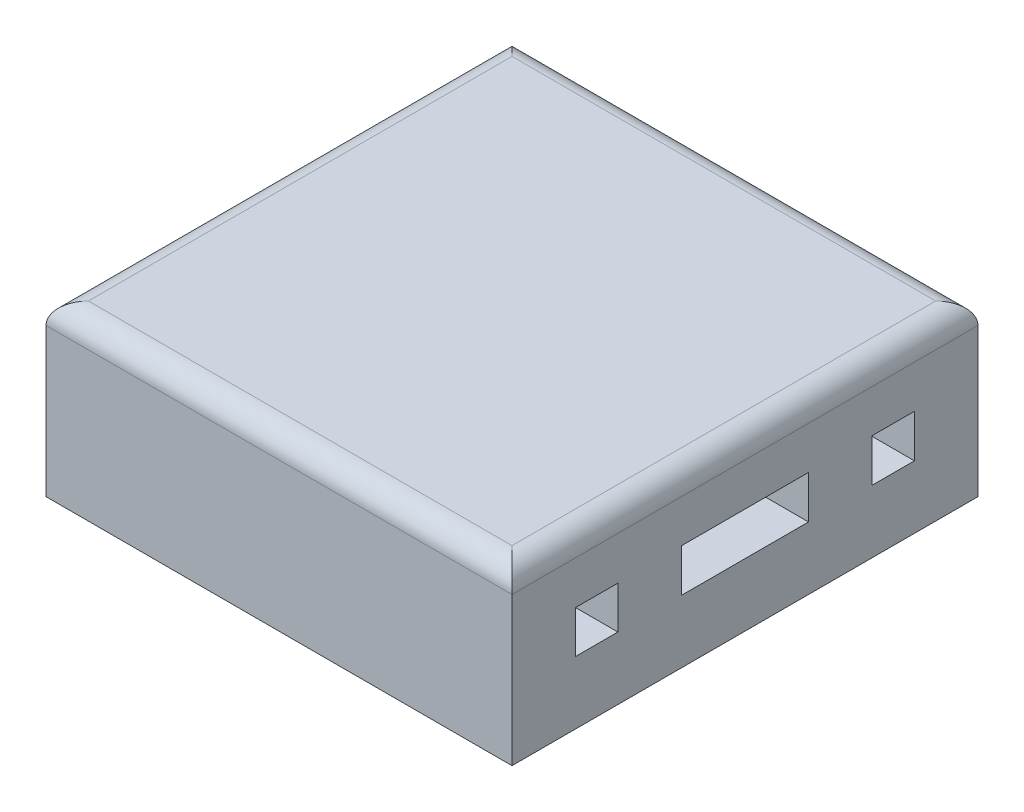
ISO-10303-21;
HEADER;
FILE_DESCRIPTION(('STEP AP214'),'2;1');
FILE_NAME('part.step','',(''),(''),'','','');
FILE_SCHEMA(('AUTOMOTIVE_DESIGN { 1 0 10303 214 1 1 1 1 }'));
ENDSEC;
DATA;
#1=APPLICATION_CONTEXT('core data for automotive mechanical design processes');
#2=APPLICATION_PROTOCOL_DEFINITION('international standard','automotive_design',2000,#1);
#3=PRODUCT_CONTEXT('',#1,'mechanical');
#4=PRODUCT('Part','Part','',(#3));
#5=PRODUCT_RELATED_PRODUCT_CATEGORY('part','',(#4));
#6=PRODUCT_DEFINITION_FORMATION('','',#4);
#7=PRODUCT_DEFINITION_CONTEXT('part definition',#1,'design');
#8=PRODUCT_DEFINITION('design','',#6,#7);
#9=PRODUCT_DEFINITION_SHAPE('','',#8);
#10=(LENGTH_UNIT() NAMED_UNIT(*) SI_UNIT(.MILLI.,.METRE.));
#11=(NAMED_UNIT(*) PLANE_ANGLE_UNIT() SI_UNIT($,.RADIAN.));
#12=(NAMED_UNIT(*) SI_UNIT($,.STERADIAN.) SOLID_ANGLE_UNIT());
#13=UNCERTAINTY_MEASURE_WITH_UNIT(LENGTH_MEASURE(1.E-05),#10,'distance_accuracy_value','');
#14=(GEOMETRIC_REPRESENTATION_CONTEXT(3) GLOBAL_UNCERTAINTY_ASSIGNED_CONTEXT((#13)) GLOBAL_UNIT_ASSIGNED_CONTEXT((#10,
#11,#12)) REPRESENTATION_CONTEXT('',''));
#15=CARTESIAN_POINT('',(0.,0.,0.));
#16=DIRECTION('',(0.,0.,1.));
#17=DIRECTION('',(1.,0.,0.));
#18=AXIS2_PLACEMENT_3D('',#15,#16,#17);
#19=CARTESIAN_POINT('',(-5.5,1.48279140521012,-1.5));
#20=DIRECTION('',(0.,-1.,0.));
#21=DIRECTION('',(0.,0.,-1.));
#22=AXIS2_PLACEMENT_3D('',#19,#20,#21);
#23=PLANE('',#22);
#24=CARTESIAN_POINT('',(0.,1.48279140521012,0.));
#25=DIRECTION('',(0.,-1.,0.));
#26=DIRECTION('',(0.,0.,-1.));
#27=AXIS2_PLACEMENT_3D('',#24,#25,#26);
#28=CIRCLE('',#27,2.25);
#29=CARTESIAN_POINT('',(-1.67705098312484,1.48279140521012,-1.5));
#30=VERTEX_POINT('',#29);
#31=CARTESIAN_POINT('',(-1.67705098312484,1.48279140521012,1.5));
#32=VERTEX_POINT('',#31);
#33=EDGE_CURVE('E195',#30,#32,#28,.F.);
#34=ORIENTED_EDGE('',*,*,#33,.F.);
#35=DIRECTION('',(1.,0.,0.));
#36=VECTOR('',#35,1.);
#37=CARTESIAN_POINT('',(-5.5,1.48279140521012,-1.5));
#38=LINE('',#37,#36);
#39=CARTESIAN_POINT('',(-5.5,1.48279140521012,-1.5));
#40=VERTEX_POINT('',#39);
#41=EDGE_CURVE('E209',#40,#30,#38,.T.);
#42=ORIENTED_EDGE('',*,*,#41,.F.);
#43=DIRECTION('',(0.,0.,-1.));
#44=VECTOR('',#43,1.);
#45=CARTESIAN_POINT('',(-5.5,1.48279140521012,-1.5));
#46=LINE('',#45,#44);
#47=CARTESIAN_POINT('',(-5.5,1.48279140521012,1.5));
#48=VERTEX_POINT('',#47);
#49=EDGE_CURVE('E382',#48,#40,#46,.T.);
#50=ORIENTED_EDGE('',*,*,#49,.F.);
#51=DIRECTION('',(1.,0.,0.));
#52=VECTOR('',#51,1.);
#53=CARTESIAN_POINT('',(-5.5,1.48279140521012,1.5));
#54=LINE('',#53,#52);
#55=EDGE_CURVE('E211',#48,#32,#54,.T.);
#56=ORIENTED_EDGE('',*,*,#55,.T.);
#57=EDGE_LOOP('',(#34,#42,#50,#56));
#58=FACE_BOUND('',#57,.T.);
#59=ADVANCED_FACE('F42',(#58),#23,.F.);
#60=CARTESIAN_POINT('',(-5.5,1.48279140521012,1.5));
#61=DIRECTION('',(0.,0.,1.));
#62=DIRECTION('',(1.,0.,0.));
#63=AXIS2_PLACEMENT_3D('',#60,#61,#62);
#64=PLANE('',#63);
#65=DIRECTION('',(0.,-1.,0.));
#66=VECTOR('',#65,1.);
#67=CARTESIAN_POINT('',(-1.67705098312484,2.5,1.5));
#68=LINE('',#67,#66);
#69=CARTESIAN_POINT('',(-1.67705098312484,2.49565823667364,1.5));
#70=VERTEX_POINT('',#69);
#71=EDGE_CURVE('E213',#32,#70,#68,.F.);
#72=ORIENTED_EDGE('',*,*,#71,.F.);
#73=ORIENTED_EDGE('',*,*,#55,.F.);
#74=DIRECTION('',(0.,-1.,0.));
#75=VECTOR('',#74,1.);
#76=CARTESIAN_POINT('',(-5.5,1.48279140521012,1.5));
#77=LINE('',#76,#75);
#78=CARTESIAN_POINT('',(-5.5,2.49565823667364,1.5));
#79=VERTEX_POINT('',#78);
#80=EDGE_CURVE('E225',#79,#48,#77,.T.);
#81=ORIENTED_EDGE('',*,*,#80,.F.);
#82=DIRECTION('',(1.,0.,0.));
#83=VECTOR('',#82,1.);
#84=CARTESIAN_POINT('',(-5.5,2.49565823667364,1.5));
#85=LINE('',#84,#83);
#86=EDGE_CURVE('E392',#79,#70,#85,.T.);
#87=ORIENTED_EDGE('',*,*,#86,.T.);
#88=EDGE_LOOP('',(#72,#73,#81,#87));
#89=FACE_BOUND('',#88,.T.);
#90=ADVANCED_FACE('F404',(#89),#64,.F.);
#91=DIRECTION('',(0.,-1.,0.));
#92=VECTOR('',#91,1.);
#93=CARTESIAN_POINT('',(1.67705098312484,2.5,1.5));
#94=LINE('',#93,#92);
#95=CARTESIAN_POINT('',(1.67705098312484,2.49565823667364,1.5));
#96=VERTEX_POINT('',#95);
#97=CARTESIAN_POINT('',(1.67705098312484,1.48279140521012,1.5));
#98=VERTEX_POINT('',#97);
#99=EDGE_CURVE('E297',#96,#98,#94,.T.);
#100=ORIENTED_EDGE('',*,*,#99,.F.);
#101=CARTESIAN_POINT('',(5.5,2.49565823667364,1.5));
#102=VERTEX_POINT('',#101);
#103=EDGE_CURVE('E394',#96,#102,#85,.T.);
#104=ORIENTED_EDGE('',*,*,#103,.T.);
#105=DIRECTION('',(0.,-1.,0.));
#106=VECTOR('',#105,1.);
#107=CARTESIAN_POINT('',(5.5,1.48279140521012,1.5));
#108=LINE('',#107,#106);
#109=CARTESIAN_POINT('',(5.5,1.48279140521012,1.5));
#110=VERTEX_POINT('',#109);
#111=EDGE_CURVE('E379',#102,#110,#108,.T.);
#112=ORIENTED_EDGE('',*,*,#111,.T.);
#113=EDGE_CURVE('E391',#98,#110,#54,.T.);
#114=ORIENTED_EDGE('',*,*,#113,.F.);
#115=EDGE_LOOP('',(#100,#104,#112,#114));
#116=FACE_BOUND('',#115,.T.);
#117=ADVANCED_FACE('F406',(#116),#64,.F.);
#118=CARTESIAN_POINT('',(-5.5,2.49565823667364,1.5));
#119=DIRECTION('',(0.,1.,0.));
#120=DIRECTION('',(0.,0.,1.));
#121=AXIS2_PLACEMENT_3D('',#118,#119,#120);
#122=PLANE('',#121);
#123=CARTESIAN_POINT('',(0.,2.49565823667364,0.));
#124=DIRECTION('',(0.,1.,0.));
#125=DIRECTION('',(0.,0.,1.));
#126=AXIS2_PLACEMENT_3D('',#123,#124,#125);
#127=CIRCLE('',#126,2.25);
#128=CARTESIAN_POINT('',(-1.67705098312484,2.49565823667364,-1.5));
#129=VERTEX_POINT('',#128);
#130=EDGE_CURVE('E198',#70,#129,#127,.F.);
#131=ORIENTED_EDGE('',*,*,#130,.F.);
#132=ORIENTED_EDGE('',*,*,#86,.F.);
#133=DIRECTION('',(0.,0.,1.));
#134=VECTOR('',#133,1.);
#135=CARTESIAN_POINT('',(-5.5,2.49565823667364,1.5));
#136=LINE('',#135,#134);
#137=CARTESIAN_POINT('',(-5.5,2.49565823667364,-1.5));
#138=VERTEX_POINT('',#137);
#139=EDGE_CURVE('E386',#138,#79,#136,.T.);
#140=ORIENTED_EDGE('',*,*,#139,.F.);
#141=DIRECTION('',(1.,0.,0.));
#142=VECTOR('',#141,1.);
#143=CARTESIAN_POINT('',(-5.5,2.49565823667364,-1.5));
#144=LINE('',#143,#142);
#145=EDGE_CURVE('E223',#138,#129,#144,.T.);
#146=ORIENTED_EDGE('',*,*,#145,.T.);
#147=EDGE_LOOP('',(#131,#132,#140,#146));
#148=FACE_BOUND('',#147,.T.);
#149=ADVANCED_FACE('F401',(#148),#122,.F.);
#150=CARTESIAN_POINT('',(-5.5,2.49565823667364,-1.5));
#151=DIRECTION('',(0.,0.,-1.));
#152=DIRECTION('',(-1.,0.,0.));
#153=AXIS2_PLACEMENT_3D('',#150,#151,#152);
#154=PLANE('',#153);
#155=DIRECTION('',(0.,-1.,0.));
#156=VECTOR('',#155,1.);
#157=CARTESIAN_POINT('',(1.67705098312484,2.5,-1.5));
#158=LINE('',#157,#156);
#159=CARTESIAN_POINT('',(1.67705098312484,1.48279140521012,-1.5));
#160=VERTEX_POINT('',#159);
#161=CARTESIAN_POINT('',(1.67705098312484,2.49565823667364,-1.5));
#162=VERTEX_POINT('',#161);
#163=EDGE_CURVE('E203',#160,#162,#158,.F.);
#164=ORIENTED_EDGE('',*,*,#163,.F.);
#165=CARTESIAN_POINT('',(5.5,1.48279140521012,-1.5));
#166=VERTEX_POINT('',#165);
#167=EDGE_CURVE('E221',#160,#166,#38,.T.);
#168=ORIENTED_EDGE('',*,*,#167,.T.);
#169=DIRECTION('',(0.,1.,0.));
#170=VECTOR('',#169,1.);
#171=CARTESIAN_POINT('',(5.5,2.49565823667364,-1.5));
#172=LINE('',#171,#170);
#173=CARTESIAN_POINT('',(5.5,2.49565823667364,-1.5));
#174=VERTEX_POINT('',#173);
#175=EDGE_CURVE('E373',#166,#174,#172,.T.);
#176=ORIENTED_EDGE('',*,*,#175,.T.);
#177=EDGE_CURVE('E220',#162,#174,#144,.T.);
#178=ORIENTED_EDGE('',*,*,#177,.F.);
#179=EDGE_LOOP('',(#164,#168,#176,#178));
#180=FACE_BOUND('',#179,.T.);
#181=ADVANCED_FACE('F424',(#180),#154,.F.);
#182=DIRECTION('',(0.,-1.,0.));
#183=VECTOR('',#182,1.);
#184=CARTESIAN_POINT('',(-1.67705098312484,2.5,-1.5));
#185=LINE('',#184,#183);
#186=EDGE_CURVE('E191',#129,#30,#185,.T.);
#187=ORIENTED_EDGE('',*,*,#186,.F.);
#188=ORIENTED_EDGE('',*,*,#145,.F.);
#189=DIRECTION('',(0.,1.,0.));
#190=VECTOR('',#189,1.);
#191=CARTESIAN_POINT('',(-5.5,2.49565823667364,-1.5));
#192=LINE('',#191,#190);
#193=EDGE_CURVE('E218',#40,#138,#192,.T.);
#194=ORIENTED_EDGE('',*,*,#193,.F.);
#195=ORIENTED_EDGE('',*,*,#41,.T.);
#196=EDGE_LOOP('',(#187,#188,#194,#195));
#197=FACE_BOUND('',#196,.T.);
#198=ADVANCED_FACE('F216',(#197),#154,.F.);
#199=CARTESIAN_POINT('',(-5.5,4.,5.5));
#200=DIRECTION('',(-1.,0.,0.));
#201=DIRECTION('',(0.,0.,1.));
#202=AXIS2_PLACEMENT_3D('',#199,#200,#201);
#203=PLANE('',#202);
#204=DIRECTION('',(0.,0.,-1.));
#205=VECTOR('',#204,1.);
#206=CARTESIAN_POINT('',(-5.5,1.48279140521012,-4.));
#207=LINE('',#206,#205);
#208=CARTESIAN_POINT('',(-5.5,1.48279140521012,-3.));
#209=VERTEX_POINT('',#208);
#210=CARTESIAN_POINT('',(-5.5,1.48279140521012,-4.));
#211=VERTEX_POINT('',#210);
#212=EDGE_CURVE('E356',#209,#211,#207,.T.);
#213=ORIENTED_EDGE('',*,*,#212,.T.);
#214=DIRECTION('',(0.,1.,0.));
#215=VECTOR('',#214,1.);
#216=CARTESIAN_POINT('',(-5.5,2.49565823667364,-4.));
#217=LINE('',#216,#215);
#218=CARTESIAN_POINT('',(-5.5,2.49565823667364,-4.));
#219=VERTEX_POINT('',#218);
#220=EDGE_CURVE('E353',#211,#219,#217,.T.);
#221=ORIENTED_EDGE('',*,*,#220,.T.);
#222=DIRECTION('',(0.,0.,1.));
#223=VECTOR('',#222,1.);
#224=CARTESIAN_POINT('',(-5.5,2.49565823667364,-3.));
#225=LINE('',#224,#223);
#226=CARTESIAN_POINT('',(-5.5,2.49565823667364,-3.));
#227=VERTEX_POINT('',#226);
#228=EDGE_CURVE('E350',#219,#227,#225,.T.);
#229=ORIENTED_EDGE('',*,*,#228,.T.);
#230=DIRECTION('',(0.,-1.,0.));
#231=VECTOR('',#230,1.);
#232=CARTESIAN_POINT('',(-5.5,1.48279140521012,-3.));
#233=LINE('',#232,#231);
#234=EDGE_CURVE('E342',#227,#209,#233,.T.);
#235=ORIENTED_EDGE('',*,*,#234,.T.);
#236=EDGE_LOOP('',(#213,#221,#229,#235));
#237=FACE_BOUND('',#236,.T.);
#238=DIRECTION('',(0.,0.,-1.));
#239=VECTOR('',#238,1.);
#240=CARTESIAN_POINT('',(-5.5,1.48279140521012,4.));
#241=LINE('',#240,#239);
#242=CARTESIAN_POINT('',(-5.5,1.48279140521012,4.));
#243=VERTEX_POINT('',#242);
#244=CARTESIAN_POINT('',(-5.5,1.48279140521012,3.));
#245=VERTEX_POINT('',#244);
#246=EDGE_CURVE('E322',#243,#245,#241,.T.);
#247=ORIENTED_EDGE('',*,*,#246,.T.);
#248=DIRECTION('',(0.,1.,0.));
#249=VECTOR('',#248,1.);
#250=CARTESIAN_POINT('',(-5.5,1.48279140521012,3.));
#251=LINE('',#250,#249);
#252=CARTESIAN_POINT('',(-5.5,2.48279140521012,3.));
#253=VERTEX_POINT('',#252);
#254=EDGE_CURVE('E319',#245,#253,#251,.T.);
#255=ORIENTED_EDGE('',*,*,#254,.T.);
#256=DIRECTION('',(0.,0.,1.));
#257=VECTOR('',#256,1.);
#258=CARTESIAN_POINT('',(-5.5,2.48279140521012,3.));
#259=LINE('',#258,#257);
#260=CARTESIAN_POINT('',(-5.5,2.48279140521012,4.));
#261=VERTEX_POINT('',#260);
#262=EDGE_CURVE('E316',#253,#261,#259,.T.);
#263=ORIENTED_EDGE('',*,*,#262,.T.);
#264=DIRECTION('',(0.,-1.,0.));
#265=VECTOR('',#264,1.);
#266=CARTESIAN_POINT('',(-5.5,1.48279140521012,4.));
#267=LINE('',#266,#265);
#268=EDGE_CURVE('E306',#261,#243,#267,.T.);
#269=ORIENTED_EDGE('',*,*,#268,.T.);
#270=EDGE_LOOP('',(#247,#255,#263,#269));
#271=FACE_BOUND('',#270,.T.);
#272=ORIENTED_EDGE('',*,*,#49,.T.);
#273=ORIENTED_EDGE('',*,*,#193,.T.);
#274=ORIENTED_EDGE('',*,*,#139,.T.);
#275=ORIENTED_EDGE('',*,*,#80,.T.);
#276=EDGE_LOOP('',(#272,#273,#274,#275));
#277=FACE_BOUND('',#276,.T.);
#278=DIRECTION('',(0.,-1.,0.));
#279=VECTOR('',#278,1.);
#280=CARTESIAN_POINT('',(-5.5,4.,5.5));
#281=LINE('',#280,#279);
#282=CARTESIAN_POINT('',(-5.5,3.5,5.5));
#283=VERTEX_POINT('',#282);
#284=CARTESIAN_POINT('',(-5.5,0.,5.5));
#285=VERTEX_POINT('',#284);
#286=EDGE_CURVE('E204',#283,#285,#281,.T.);
#287=ORIENTED_EDGE('',*,*,#286,.F.);
#288=DIRECTION('',(0.,0.,-1.));
#289=VECTOR('',#288,1.);
#290=CARTESIAN_POINT('',(-5.5,3.5,-5.5));
#291=LINE('',#290,#289);
#292=CARTESIAN_POINT('',(-5.5,3.5,-5.5));
#293=VERTEX_POINT('',#292);
#294=EDGE_CURVE('E66',#283,#293,#291,.T.);
#295=ORIENTED_EDGE('',*,*,#294,.T.);
#296=DIRECTION('',(0.,-1.,0.));
#297=VECTOR('',#296,1.);
#298=CARTESIAN_POINT('',(-5.5,4.,-5.5));
#299=LINE('',#298,#297);
#300=CARTESIAN_POINT('',(-5.5,0.,-5.5));
#301=VERTEX_POINT('',#300);
#302=EDGE_CURVE('E242',#293,#301,#299,.T.);
#303=ORIENTED_EDGE('',*,*,#302,.T.);
#304=DIRECTION('',(0.,0.,-1.));
#305=VECTOR('',#304,1.);
#306=CARTESIAN_POINT('',(-5.5,0.,5.5));
#307=LINE('',#306,#305);
#308=EDGE_CURVE('E228',#285,#301,#307,.T.);
#309=ORIENTED_EDGE('',*,*,#308,.F.);
#310=EDGE_LOOP('',(#287,#295,#303,#309));
#311=FACE_BOUND('',#310,.T.);
#312=ADVANCED_FACE('F403',(#237,#271,#277,#311),#203,.T.);
#313=CARTESIAN_POINT('',(-5.5,4.,5.5));
#314=DIRECTION('',(0.,0.,-1.));
#315=DIRECTION('',(-1.,0.,0.));
#316=AXIS2_PLACEMENT_3D('',#313,#314,#315);
#317=PLANE('',#316);
#318=DIRECTION('',(0.,-1.,0.));
#319=VECTOR('',#318,1.);
#320=CARTESIAN_POINT('',(5.5,4.,5.5));
#321=LINE('',#320,#319);
#322=CARTESIAN_POINT('',(5.5,3.5,5.5));
#323=VERTEX_POINT('',#322);
#324=CARTESIAN_POINT('',(5.5,0.,5.5));
#325=VERTEX_POINT('',#324);
#326=EDGE_CURVE('E244',#323,#325,#321,.T.);
#327=ORIENTED_EDGE('',*,*,#326,.F.);
#328=DIRECTION('',(1.,0.,0.));
#329=VECTOR('',#328,1.);
#330=CARTESIAN_POINT('',(-5.5,3.5,5.5));
#331=LINE('',#330,#329);
#332=EDGE_CURVE('E259',#323,#283,#331,.F.);
#333=ORIENTED_EDGE('',*,*,#332,.T.);
#334=ORIENTED_EDGE('',*,*,#286,.T.);
#335=DIRECTION('',(1.,0.,0.));
#336=VECTOR('',#335,1.);
#337=CARTESIAN_POINT('',(-5.5,0.,5.5));
#338=LINE('',#337,#336);
#339=EDGE_CURVE('E238',#285,#325,#338,.T.);
#340=ORIENTED_EDGE('',*,*,#339,.T.);
#341=EDGE_LOOP('',(#327,#333,#334,#340));
#342=FACE_BOUND('',#341,.T.);
#343=ADVANCED_FACE('F438',(#342),#317,.F.);
#344=CARTESIAN_POINT('',(5.5,4.,-5.5));
#345=DIRECTION('',(1.,0.,0.));
#346=DIRECTION('',(0.,0.,-1.));
#347=AXIS2_PLACEMENT_3D('',#344,#345,#346);
#348=PLANE('',#347);
#349=DIRECTION('',(0.,0.,-1.));
#350=VECTOR('',#349,1.);
#351=CARTESIAN_POINT('',(5.5,1.48279140521012,-4.));
#352=LINE('',#351,#350);
#353=CARTESIAN_POINT('',(5.5,1.48279140521012,-3.));
#354=VERTEX_POINT('',#353);
#355=CARTESIAN_POINT('',(5.5,1.48279140521012,-4.));
#356=VERTEX_POINT('',#355);
#357=EDGE_CURVE('E313',#354,#356,#352,.T.);
#358=ORIENTED_EDGE('',*,*,#357,.F.);
#359=DIRECTION('',(0.,-1.,0.));
#360=VECTOR('',#359,1.);
#361=CARTESIAN_POINT('',(5.5,1.48279140521012,-3.));
#362=LINE('',#361,#360);
#363=CARTESIAN_POINT('',(5.5,2.49565823667364,-3.));
#364=VERTEX_POINT('',#363);
#365=EDGE_CURVE('E359',#364,#354,#362,.T.);
#366=ORIENTED_EDGE('',*,*,#365,.F.);
#367=DIRECTION('',(0.,0.,1.));
#368=VECTOR('',#367,1.);
#369=CARTESIAN_POINT('',(5.5,2.49565823667364,-3.));
#370=LINE('',#369,#368);
#371=CARTESIAN_POINT('',(5.5,2.49565823667364,-4.));
#372=VERTEX_POINT('',#371);
#373=EDGE_CURVE('E362',#372,#364,#370,.T.);
#374=ORIENTED_EDGE('',*,*,#373,.F.);
#375=DIRECTION('',(0.,1.,0.));
#376=VECTOR('',#375,1.);
#377=CARTESIAN_POINT('',(5.5,2.49565823667364,-4.));
#378=LINE('',#377,#376);
#379=EDGE_CURVE('E365',#356,#372,#378,.T.);
#380=ORIENTED_EDGE('',*,*,#379,.F.);
#381=EDGE_LOOP('',(#358,#366,#374,#380));
#382=FACE_BOUND('',#381,.T.);
#383=DIRECTION('',(0.,0.,-1.));
#384=VECTOR('',#383,1.);
#385=CARTESIAN_POINT('',(5.5,1.48279140521012,4.));
#386=LINE('',#385,#384);
#387=CARTESIAN_POINT('',(5.5,1.48279140521012,4.));
#388=VERTEX_POINT('',#387);
#389=CARTESIAN_POINT('',(5.5,1.48279140521012,3.));
#390=VERTEX_POINT('',#389);
#391=EDGE_CURVE('E335',#388,#390,#386,.T.);
#392=ORIENTED_EDGE('',*,*,#391,.F.);
#393=DIRECTION('',(0.,-1.,0.));
#394=VECTOR('',#393,1.);
#395=CARTESIAN_POINT('',(5.5,1.48279140521012,4.));
#396=LINE('',#395,#394);
#397=CARTESIAN_POINT('',(5.5,2.48279140521012,4.));
#398=VERTEX_POINT('',#397);
#399=EDGE_CURVE('E326',#398,#388,#396,.T.);
#400=ORIENTED_EDGE('',*,*,#399,.F.);
#401=DIRECTION('',(0.,0.,1.));
#402=VECTOR('',#401,1.);
#403=CARTESIAN_POINT('',(5.5,2.48279140521012,3.));
#404=LINE('',#403,#402);
#405=CARTESIAN_POINT('',(5.5,2.48279140521012,3.));
#406=VERTEX_POINT('',#405);
#407=EDGE_CURVE('E329',#406,#398,#404,.T.);
#408=ORIENTED_EDGE('',*,*,#407,.F.);
#409=DIRECTION('',(0.,1.,0.));
#410=VECTOR('',#409,1.);
#411=CARTESIAN_POINT('',(5.5,1.48279140521012,3.));
#412=LINE('',#411,#410);
#413=EDGE_CURVE('E332',#390,#406,#412,.T.);
#414=ORIENTED_EDGE('',*,*,#413,.F.);
#415=EDGE_LOOP('',(#392,#400,#408,#414));
#416=FACE_BOUND('',#415,.T.);
#417=DIRECTION('',(0.,0.,-1.));
#418=VECTOR('',#417,1.);
#419=CARTESIAN_POINT('',(5.5,1.48279140521012,-1.5));
#420=LINE('',#419,#418);
#421=EDGE_CURVE('E338',#110,#166,#420,.T.);
#422=ORIENTED_EDGE('',*,*,#421,.F.);
#423=ORIENTED_EDGE('',*,*,#111,.F.);
#424=DIRECTION('',(0.,0.,1.));
#425=VECTOR('',#424,1.);
#426=CARTESIAN_POINT('',(5.5,2.49565823667364,1.5));
#427=LINE('',#426,#425);
#428=EDGE_CURVE('E376',#174,#102,#427,.T.);
#429=ORIENTED_EDGE('',*,*,#428,.F.);
#430=ORIENTED_EDGE('',*,*,#175,.F.);
#431=EDGE_LOOP('',(#422,#423,#429,#430));
#432=FACE_BOUND('',#431,.T.);
#433=DIRECTION('',(0.,-1.,0.));
#434=VECTOR('',#433,1.);
#435=CARTESIAN_POINT('',(5.5,4.,-5.5));
#436=LINE('',#435,#434);
#437=CARTESIAN_POINT('',(5.5,3.5,-5.5));
#438=VERTEX_POINT('',#437);
#439=CARTESIAN_POINT('',(5.5,0.,-5.5));
#440=VERTEX_POINT('',#439);
#441=EDGE_CURVE('E246',#438,#440,#436,.T.);
#442=ORIENTED_EDGE('',*,*,#441,.F.);
#443=DIRECTION('',(0.,0.,1.));
#444=VECTOR('',#443,1.);
#445=CARTESIAN_POINT('',(5.5,3.5,5.5));
#446=LINE('',#445,#444);
#447=EDGE_CURVE('E11',#438,#323,#446,.T.);
#448=ORIENTED_EDGE('',*,*,#447,.T.);
#449=ORIENTED_EDGE('',*,*,#326,.T.);
#450=DIRECTION('',(0.,0.,1.));
#451=VECTOR('',#450,1.);
#452=CARTESIAN_POINT('',(5.5,0.,-5.5));
#453=LINE('',#452,#451);
#454=EDGE_CURVE('E235',#440,#325,#453,.T.);
#455=ORIENTED_EDGE('',*,*,#454,.F.);
#456=EDGE_LOOP('',(#442,#448,#449,#455));
#457=FACE_BOUND('',#456,.T.);
#458=ADVANCED_FACE('F441',(#382,#416,#432,#457),#348,.T.);
#459=CARTESIAN_POINT('',(-5.5,4.,-5.5));
#460=DIRECTION('',(0.,0.,-1.));
#461=DIRECTION('',(-1.,0.,0.));
#462=AXIS2_PLACEMENT_3D('',#459,#460,#461);
#463=PLANE('',#462);
#464=ORIENTED_EDGE('',*,*,#302,.F.);
#465=DIRECTION('',(1.,0.,0.));
#466=VECTOR('',#465,1.);
#467=CARTESIAN_POINT('',(5.5,3.5,-5.5));
#468=LINE('',#467,#466);
#469=EDGE_CURVE('E51',#293,#438,#468,.T.);
#470=ORIENTED_EDGE('',*,*,#469,.T.);
#471=ORIENTED_EDGE('',*,*,#441,.T.);
#472=DIRECTION('',(1.,0.,0.));
#473=VECTOR('',#472,1.);
#474=CARTESIAN_POINT('',(-5.5,0.,-5.5));
#475=LINE('',#474,#473);
#476=EDGE_CURVE('E231',#301,#440,#475,.T.);
#477=ORIENTED_EDGE('',*,*,#476,.F.);
#478=EDGE_LOOP('',(#464,#470,#471,#477));
#479=FACE_BOUND('',#478,.T.);
#480=ADVANCED_FACE('F434',(#479),#463,.T.);
#481=CARTESIAN_POINT('',(0.,4.,0.));
#482=DIRECTION('',(0.,-1.,0.));
#483=DIRECTION('',(0.,0.,-1.));
#484=AXIS2_PLACEMENT_3D('',#481,#482,#483);
#485=PLANE('',#484);
#486=DIRECTION('',(0.,0.,-1.));
#487=VECTOR('',#486,1.);
#488=CARTESIAN_POINT('',(-5.,4.,5.5));
#489=LINE('',#488,#487);
#490=CARTESIAN_POINT('',(-5.,4.,-5.));
#491=VERTEX_POINT('',#490);
#492=CARTESIAN_POINT('',(-5.,4.,5.));
#493=VERTEX_POINT('',#492);
#494=EDGE_CURVE('E254',#491,#493,#489,.F.);
#495=ORIENTED_EDGE('',*,*,#494,.T.);
#496=DIRECTION('',(1.,0.,0.));
#497=VECTOR('',#496,1.);
#498=CARTESIAN_POINT('',(0.,4.,5.));
#499=LINE('',#498,#497);
#500=CARTESIAN_POINT('',(5.,4.,5.));
#501=VERTEX_POINT('',#500);
#502=EDGE_CURVE('E256',#493,#501,#499,.T.);
#503=ORIENTED_EDGE('',*,*,#502,.T.);
#504=DIRECTION('',(0.,0.,1.));
#505=VECTOR('',#504,1.);
#506=CARTESIAN_POINT('',(5.,4.,-5.5));
#507=LINE('',#506,#505);
#508=CARTESIAN_POINT('',(5.,4.,-5.));
#509=VERTEX_POINT('',#508);
#510=EDGE_CURVE('E250',#501,#509,#507,.F.);
#511=ORIENTED_EDGE('',*,*,#510,.T.);
#512=DIRECTION('',(1.,0.,0.));
#513=VECTOR('',#512,1.);
#514=CARTESIAN_POINT('',(-5.5,4.,-5.));
#515=LINE('',#514,#513);
#516=EDGE_CURVE('E252',#509,#491,#515,.F.);
#517=ORIENTED_EDGE('',*,*,#516,.T.);
#518=EDGE_LOOP('',(#495,#503,#511,#517));
#519=FACE_BOUND('',#518,.T.);
#520=ADVANCED_FACE('F431',(#519),#485,.F.);
#521=CARTESIAN_POINT('',(0.,0.,0.));
#522=DIRECTION('',(0.,-1.,0.));
#523=DIRECTION('',(0.,0.,-1.));
#524=AXIS2_PLACEMENT_3D('',#521,#522,#523);
#525=PLANE('',#524);
#526=CARTESIAN_POINT('',(0.,0.,-4.));
#527=DIRECTION('',(0.,1.,0.));
#528=DIRECTION('',(0.,0.,1.));
#529=AXIS2_PLACEMENT_3D('',#526,#527,#528);
#530=CIRCLE('',#529,1.);
#531=CARTESIAN_POINT('',(0.,0.,-3.));
#532=VERTEX_POINT('',#531);
#533=EDGE_CURVE('E274',#532,#532,#530,.T.);
#534=ORIENTED_EDGE('',*,*,#533,.T.);
#535=EDGE_LOOP('',(#534));
#536=FACE_BOUND('',#535,.T.);
#537=CARTESIAN_POINT('',(0.,0.,4.));
#538=DIRECTION('',(0.,1.,0.));
#539=DIRECTION('',(0.,0.,1.));
#540=AXIS2_PLACEMENT_3D('',#537,#538,#539);
#541=CIRCLE('',#540,1.);
#542=CARTESIAN_POINT('',(0.,0.,5.));
#543=VERTEX_POINT('',#542);
#544=EDGE_CURVE('E284',#543,#543,#541,.T.);
#545=ORIENTED_EDGE('',*,*,#544,.T.);
#546=EDGE_LOOP('',(#545));
#547=FACE_BOUND('',#546,.T.);
#548=CARTESIAN_POINT('',(0.,0.,0.));
#549=DIRECTION('',(0.,-1.,0.));
#550=DIRECTION('',(0.,0.,-1.));
#551=AXIS2_PLACEMENT_3D('',#548,#549,#550);
#552=CIRCLE('',#551,2.25);
#553=CARTESIAN_POINT('',(0.,0.,-2.25));
#554=VERTEX_POINT('',#553);
#555=EDGE_CURVE('E299',#554,#554,#552,.F.);
#556=ORIENTED_EDGE('',*,*,#555,.T.);
#557=EDGE_LOOP('',(#556));
#558=FACE_BOUND('',#557,.T.);
#559=ORIENTED_EDGE('',*,*,#308,.T.);
#560=ORIENTED_EDGE('',*,*,#476,.T.);
#561=ORIENTED_EDGE('',*,*,#454,.T.);
#562=ORIENTED_EDGE('',*,*,#339,.F.);
#563=EDGE_LOOP('',(#559,#560,#561,#562));
#564=FACE_BOUND('',#563,.T.);
#565=ADVANCED_FACE('F429',(#536,#547,#558,#564),#525,.T.);
#566=EDGE_CURVE('E215',#98,#160,#28,.F.);
#567=ORIENTED_EDGE('',*,*,#566,.F.);
#568=ORIENTED_EDGE('',*,*,#113,.T.);
#569=ORIENTED_EDGE('',*,*,#421,.T.);
#570=ORIENTED_EDGE('',*,*,#167,.F.);
#571=EDGE_LOOP('',(#567,#568,#569,#570));
#572=FACE_BOUND('',#571,.T.);
#573=ADVANCED_FACE('F414',(#572),#23,.F.);
#574=EDGE_CURVE('E212',#162,#96,#127,.F.);
#575=ORIENTED_EDGE('',*,*,#574,.F.);
#576=ORIENTED_EDGE('',*,*,#177,.T.);
#577=ORIENTED_EDGE('',*,*,#428,.T.);
#578=ORIENTED_EDGE('',*,*,#103,.F.);
#579=EDGE_LOOP('',(#575,#576,#577,#578));
#580=FACE_BOUND('',#579,.T.);
#581=ADVANCED_FACE('F419',(#580),#122,.F.);
#582=CARTESIAN_POINT('',(-5.5,1.48279140521012,4.));
#583=DIRECTION('',(0.,-1.,0.));
#584=DIRECTION('',(0.,0.,-1.));
#585=AXIS2_PLACEMENT_3D('',#582,#583,#584);
#586=PLANE('',#585);
#587=DIRECTION('',(1.,0.,0.));
#588=VECTOR('',#587,1.);
#589=CARTESIAN_POINT('',(-5.5,1.48279140521012,3.));
#590=LINE('',#589,#588);
#591=EDGE_CURVE('E303',#245,#390,#590,.T.);
#592=ORIENTED_EDGE('',*,*,#591,.F.);
#593=ORIENTED_EDGE('',*,*,#246,.F.);
#594=DIRECTION('',(1.,0.,0.));
#595=VECTOR('',#594,1.);
#596=CARTESIAN_POINT('',(-5.5,1.48279140521012,4.));
#597=LINE('',#596,#595);
#598=EDGE_CURVE('E311',#243,#388,#597,.T.);
#599=ORIENTED_EDGE('',*,*,#598,.T.);
#600=ORIENTED_EDGE('',*,*,#391,.T.);
#601=EDGE_LOOP('',(#592,#593,#599,#600));
#602=FACE_BOUND('',#601,.T.);
#603=ADVANCED_FACE('F422',(#602),#586,.F.);
#604=CARTESIAN_POINT('',(-5.5,1.48279140521012,4.));
#605=DIRECTION('',(0.,0.,1.));
#606=DIRECTION('',(1.,0.,0.));
#607=AXIS2_PLACEMENT_3D('',#604,#605,#606);
#608=PLANE('',#607);
#609=ORIENTED_EDGE('',*,*,#598,.F.);
#610=ORIENTED_EDGE('',*,*,#268,.F.);
#611=DIRECTION('',(1.,0.,0.));
#612=VECTOR('',#611,1.);
#613=CARTESIAN_POINT('',(-5.5,2.48279140521012,4.));
#614=LINE('',#613,#612);
#615=EDGE_CURVE('E309',#261,#398,#614,.T.);
#616=ORIENTED_EDGE('',*,*,#615,.T.);
#617=ORIENTED_EDGE('',*,*,#399,.T.);
#618=EDGE_LOOP('',(#609,#610,#616,#617));
#619=FACE_BOUND('',#618,.T.);
#620=ADVANCED_FACE('F507',(#619),#608,.F.);
#621=CARTESIAN_POINT('',(-5.5,2.48279140521012,3.));
#622=DIRECTION('',(0.,1.,0.));
#623=DIRECTION('',(0.,0.,1.));
#624=AXIS2_PLACEMENT_3D('',#621,#622,#623);
#625=PLANE('',#624);
#626=ORIENTED_EDGE('',*,*,#615,.F.);
#627=ORIENTED_EDGE('',*,*,#262,.F.);
#628=DIRECTION('',(1.,0.,0.));
#629=VECTOR('',#628,1.);
#630=CARTESIAN_POINT('',(-5.5,2.48279140521012,3.));
#631=LINE('',#630,#629);
#632=EDGE_CURVE('E307',#253,#406,#631,.T.);
#633=ORIENTED_EDGE('',*,*,#632,.T.);
#634=ORIENTED_EDGE('',*,*,#407,.T.);
#635=EDGE_LOOP('',(#626,#627,#633,#634));
#636=FACE_BOUND('',#635,.T.);
#637=ADVANCED_FACE('F513',(#636),#625,.F.);
#638=CARTESIAN_POINT('',(-5.5,1.48279140521012,3.));
#639=DIRECTION('',(0.,0.,-1.));
#640=DIRECTION('',(-1.,0.,0.));
#641=AXIS2_PLACEMENT_3D('',#638,#639,#640);
#642=PLANE('',#641);
#643=ORIENTED_EDGE('',*,*,#632,.F.);
#644=ORIENTED_EDGE('',*,*,#254,.F.);
#645=ORIENTED_EDGE('',*,*,#591,.T.);
#646=ORIENTED_EDGE('',*,*,#413,.T.);
#647=EDGE_LOOP('',(#643,#644,#645,#646));
#648=FACE_BOUND('',#647,.T.);
#649=ADVANCED_FACE('F509',(#648),#642,.F.);
#650=CARTESIAN_POINT('',(-5.5,1.48279140521012,-4.));
#651=DIRECTION('',(0.,-1.,0.));
#652=DIRECTION('',(0.,0.,-1.));
#653=AXIS2_PLACEMENT_3D('',#650,#651,#652);
#654=PLANE('',#653);
#655=DIRECTION('',(1.,0.,0.));
#656=VECTOR('',#655,1.);
#657=CARTESIAN_POINT('',(-5.5,1.48279140521012,-4.));
#658=LINE('',#657,#656);
#659=EDGE_CURVE('E339',#211,#356,#658,.T.);
#660=ORIENTED_EDGE('',*,*,#659,.F.);
#661=ORIENTED_EDGE('',*,*,#212,.F.);
#662=DIRECTION('',(1.,0.,0.));
#663=VECTOR('',#662,1.);
#664=CARTESIAN_POINT('',(-5.5,1.48279140521012,-3.));
#665=LINE('',#664,#663);
#666=EDGE_CURVE('E302',#209,#354,#665,.T.);
#667=ORIENTED_EDGE('',*,*,#666,.T.);
#668=ORIENTED_EDGE('',*,*,#357,.T.);
#669=EDGE_LOOP('',(#660,#661,#667,#668));
#670=FACE_BOUND('',#669,.T.);
#671=ADVANCED_FACE('F512',(#670),#654,.F.);
#672=CARTESIAN_POINT('',(-5.5,1.48279140521012,-3.));
#673=DIRECTION('',(0.,0.,1.));
#674=DIRECTION('',(1.,0.,0.));
#675=AXIS2_PLACEMENT_3D('',#672,#673,#674);
#676=PLANE('',#675);
#677=ORIENTED_EDGE('',*,*,#666,.F.);
#678=ORIENTED_EDGE('',*,*,#234,.F.);
#679=DIRECTION('',(1.,0.,0.));
#680=VECTOR('',#679,1.);
#681=CARTESIAN_POINT('',(-5.5,2.49565823667364,-3.));
#682=LINE('',#681,#680);
#683=EDGE_CURVE('E345',#227,#364,#682,.T.);
#684=ORIENTED_EDGE('',*,*,#683,.T.);
#685=ORIENTED_EDGE('',*,*,#365,.T.);
#686=EDGE_LOOP('',(#677,#678,#684,#685));
#687=FACE_BOUND('',#686,.T.);
#688=ADVANCED_FACE('F417',(#687),#676,.F.);
#689=CARTESIAN_POINT('',(-5.5,2.49565823667364,-3.));
#690=DIRECTION('',(0.,1.,0.));
#691=DIRECTION('',(0.,0.,1.));
#692=AXIS2_PLACEMENT_3D('',#689,#690,#691);
#693=PLANE('',#692);
#694=ORIENTED_EDGE('',*,*,#683,.F.);
#695=ORIENTED_EDGE('',*,*,#228,.F.);
#696=DIRECTION('',(1.,0.,0.));
#697=VECTOR('',#696,1.);
#698=CARTESIAN_POINT('',(-5.5,2.49565823667364,-4.));
#699=LINE('',#698,#697);
#700=EDGE_CURVE('E343',#219,#372,#699,.T.);
#701=ORIENTED_EDGE('',*,*,#700,.T.);
#702=ORIENTED_EDGE('',*,*,#373,.T.);
#703=EDGE_LOOP('',(#694,#695,#701,#702));
#704=FACE_BOUND('',#703,.T.);
#705=ADVANCED_FACE('F525',(#704),#693,.F.);
#706=CARTESIAN_POINT('',(-5.5,2.49565823667364,-4.));
#707=DIRECTION('',(0.,0.,-1.));
#708=DIRECTION('',(-1.,0.,0.));
#709=AXIS2_PLACEMENT_3D('',#706,#707,#708);
#710=PLANE('',#709);
#711=ORIENTED_EDGE('',*,*,#700,.F.);
#712=ORIENTED_EDGE('',*,*,#220,.F.);
#713=ORIENTED_EDGE('',*,*,#659,.T.);
#714=ORIENTED_EDGE('',*,*,#379,.T.);
#715=EDGE_LOOP('',(#711,#712,#713,#714));
#716=FACE_BOUND('',#715,.T.);
#717=ADVANCED_FACE('F503',(#716),#710,.F.);
#718=CARTESIAN_POINT('',(0.,2.5,0.));
#719=DIRECTION('',(0.,-1.,0.));
#720=DIRECTION('',(0.,0.,-1.));
#721=AXIS2_PLACEMENT_3D('',#718,#719,#720);
#722=CYLINDRICAL_SURFACE('',#721,2.25);
#723=ORIENTED_EDGE('',*,*,#555,.F.);
#724=EDGE_LOOP('',(#723));
#725=FACE_BOUND('',#724,.T.);
#726=ORIENTED_EDGE('',*,*,#33,.T.);
#727=ORIENTED_EDGE('',*,*,#71,.T.);
#728=ORIENTED_EDGE('',*,*,#130,.T.);
#729=ORIENTED_EDGE('',*,*,#186,.T.);
#730=EDGE_LOOP('',(#726,#727,#728,#729));
#731=FACE_BOUND('',#730,.T.);
#732=CARTESIAN_POINT('',(0.,2.5,0.));
#733=DIRECTION('',(0.,1.,0.));
#734=DIRECTION('',(0.,0.,1.));
#735=AXIS2_PLACEMENT_3D('',#732,#733,#734);
#736=CIRCLE('',#735,2.25);
#737=CARTESIAN_POINT('',(0.,2.5,2.25));
#738=VERTEX_POINT('',#737);
#739=EDGE_CURVE('E290',#738,#738,#736,.T.);
#740=ORIENTED_EDGE('',*,*,#739,.T.);
#741=EDGE_LOOP('',(#740));
#742=FACE_BOUND('',#741,.T.);
#743=ORIENTED_EDGE('',*,*,#566,.T.);
#744=ORIENTED_EDGE('',*,*,#163,.T.);
#745=ORIENTED_EDGE('',*,*,#574,.T.);
#746=ORIENTED_EDGE('',*,*,#99,.T.);
#747=EDGE_LOOP('',(#743,#744,#745,#746));
#748=FACE_BOUND('',#747,.T.);
#749=ADVANCED_FACE('F193',(#725,#731,#742,#748),#722,.F.);
#750=CARTESIAN_POINT('',(0.,2.5,0.));
#751=DIRECTION('',(0.,1.,0.));
#752=DIRECTION('',(0.,0.,1.));
#753=AXIS2_PLACEMENT_3D('',#750,#751,#752);
#754=PLANE('',#753);
#755=ORIENTED_EDGE('',*,*,#739,.F.);
#756=EDGE_LOOP('',(#755));
#757=FACE_BOUND('',#756,.T.);
#758=ADVANCED_FACE('F496',(#757),#754,.F.);
#759=CARTESIAN_POINT('',(0.,1.,4.));
#760=DIRECTION('',(0.,-1.,0.));
#761=DIRECTION('',(0.,0.,-1.));
#762=AXIS2_PLACEMENT_3D('',#759,#760,#761);
#763=CYLINDRICAL_SURFACE('',#762,1.);
#764=CARTESIAN_POINT('',(0.,1.,4.));
#765=DIRECTION('',(0.,1.,0.));
#766=DIRECTION('',(0.,0.,1.));
#767=AXIS2_PLACEMENT_3D('',#764,#765,#766);
#768=CIRCLE('',#767,1.);
#769=CARTESIAN_POINT('',(0.,1.,5.));
#770=VERTEX_POINT('',#769);
#771=EDGE_CURVE('E287',#770,#770,#768,.T.);
#772=ORIENTED_EDGE('',*,*,#771,.T.);
#773=EDGE_LOOP('',(#772));
#774=FACE_BOUND('',#773,.T.);
#775=ORIENTED_EDGE('',*,*,#544,.F.);
#776=EDGE_LOOP('',(#775));
#777=FACE_BOUND('',#776,.T.);
#778=ADVANCED_FACE('F493',(#774,#777),#763,.F.);
#779=CARTESIAN_POINT('',(0.,1.,4.));
#780=DIRECTION('',(0.,1.,0.));
#781=DIRECTION('',(0.,0.,1.));
#782=AXIS2_PLACEMENT_3D('',#779,#780,#781);
#783=PLANE('',#782);
#784=ORIENTED_EDGE('',*,*,#771,.F.);
#785=EDGE_LOOP('',(#784));
#786=FACE_BOUND('',#785,.T.);
#787=ADVANCED_FACE('F486',(#786),#783,.F.);
#788=CARTESIAN_POINT('',(0.,0.55,-4.));
#789=DIRECTION('',(0.,-1.,0.));
#790=DIRECTION('',(0.,0.,-1.));
#791=AXIS2_PLACEMENT_3D('',#788,#789,#790);
#792=CYLINDRICAL_SURFACE('',#791,1.);
#793=CARTESIAN_POINT('',(0.,0.55,-4.));
#794=DIRECTION('',(0.,1.,0.));
#795=DIRECTION('',(0.,0.,1.));
#796=AXIS2_PLACEMENT_3D('',#793,#794,#795);
#797=CIRCLE('',#796,1.);
#798=CARTESIAN_POINT('',(0.,0.55,-3.));
#799=VERTEX_POINT('',#798);
#800=EDGE_CURVE('E279',#799,#799,#797,.T.);
#801=ORIENTED_EDGE('',*,*,#800,.T.);
#802=EDGE_LOOP('',(#801));
#803=FACE_BOUND('',#802,.T.);
#804=ORIENTED_EDGE('',*,*,#533,.F.);
#805=EDGE_LOOP('',(#804));
#806=FACE_BOUND('',#805,.T.);
#807=ADVANCED_FACE('F467',(#803,#806),#792,.F.);
#808=CARTESIAN_POINT('',(0.,0.55,-4.));
#809=DIRECTION('',(0.,1.,0.));
#810=DIRECTION('',(0.,0.,1.));
#811=AXIS2_PLACEMENT_3D('',#808,#809,#810);
#812=PLANE('',#811);
#813=ORIENTED_EDGE('',*,*,#800,.F.);
#814=EDGE_LOOP('',(#813));
#815=FACE_BOUND('',#814,.T.);
#816=ADVANCED_FACE('F462',(#815),#812,.F.);
#817=CARTESIAN_POINT('',(-5.5,3.5,-5.));
#818=DIRECTION('',(-1.,0.,0.));
#819=DIRECTION('',(0.,0.,1.));
#820=AXIS2_PLACEMENT_3D('',#817,#818,#819);
#821=CYLINDRICAL_SURFACE('',#820,0.5);
#822=CARTESIAN_POINT('',(5.,3.5,-5.));
#823=DIRECTION('',(-0.707106781186547,0.,-0.707106781186547));
#824=DIRECTION('',(0.707106781186547,0.,-0.707106781186548));
#825=AXIS2_PLACEMENT_3D('',#822,#823,#824);
#826=ELLIPSE('',#825,0.707106781186547,0.5);
#827=EDGE_CURVE('E267',#438,#509,#826,.F.);
#828=ORIENTED_EDGE('',*,*,#827,.F.);
#829=ORIENTED_EDGE('',*,*,#469,.F.);
#830=CARTESIAN_POINT('',(-5.,3.5,-5.));
#831=DIRECTION('',(-0.707106781186547,0.,0.707106781186547));
#832=DIRECTION('',(-0.707106781186547,0.,-0.707106781186547));
#833=AXIS2_PLACEMENT_3D('',#830,#831,#832);
#834=ELLIPSE('',#833,0.707106781186547,0.5);
#835=EDGE_CURVE('E46',#491,#293,#834,.T.);
#836=ORIENTED_EDGE('',*,*,#835,.F.);
#837=ORIENTED_EDGE('',*,*,#516,.F.);
#838=EDGE_LOOP('',(#828,#829,#836,#837));
#839=FACE_BOUND('',#838,.T.);
#840=ADVANCED_FACE('F44',(#839),#821,.T.);
#841=CARTESIAN_POINT('',(-5.,3.5,5.5));
#842=DIRECTION('',(0.,0.,1.));
#843=DIRECTION('',(1.,0.,0.));
#844=AXIS2_PLACEMENT_3D('',#841,#842,#843);
#845=CYLINDRICAL_SURFACE('',#844,0.5);
#846=ORIENTED_EDGE('',*,*,#835,.T.);
#847=ORIENTED_EDGE('',*,*,#294,.F.);
#848=CARTESIAN_POINT('',(-5.,3.5,5.));
#849=DIRECTION('',(0.707106781186547,0.,0.707106781186547));
#850=DIRECTION('',(-0.707106781186547,0.,0.707106781186547));
#851=AXIS2_PLACEMENT_3D('',#848,#849,#850);
#852=ELLIPSE('',#851,0.707106781186547,0.5);
#853=EDGE_CURVE('E266',#493,#283,#852,.T.);
#854=ORIENTED_EDGE('',*,*,#853,.F.);
#855=ORIENTED_EDGE('',*,*,#494,.F.);
#856=EDGE_LOOP('',(#846,#847,#854,#855));
#857=FACE_BOUND('',#856,.T.);
#858=ADVANCED_FACE('F457',(#857),#845,.T.);
#859=CARTESIAN_POINT('',(5.,3.5,-5.5));
#860=DIRECTION('',(0.,0.,-1.));
#861=DIRECTION('',(-1.,0.,0.));
#862=AXIS2_PLACEMENT_3D('',#859,#860,#861);
#863=CYLINDRICAL_SURFACE('',#862,0.5);
#864=ORIENTED_EDGE('',*,*,#827,.T.);
#865=ORIENTED_EDGE('',*,*,#510,.F.);
#866=CARTESIAN_POINT('',(5.,3.5,5.));
#867=DIRECTION('',(0.707106781186547,0.,-0.707106781186548));
#868=DIRECTION('',(-0.707106781186547,0.,-0.707106781186547));
#869=AXIS2_PLACEMENT_3D('',#866,#867,#868);
#870=ELLIPSE('',#869,0.707106781186548,0.5);
#871=EDGE_CURVE('E264',#323,#501,#870,.F.);
#872=ORIENTED_EDGE('',*,*,#871,.F.);
#873=ORIENTED_EDGE('',*,*,#447,.F.);
#874=EDGE_LOOP('',(#864,#865,#872,#873));
#875=FACE_BOUND('',#874,.T.);
#876=ADVANCED_FACE('F454',(#875),#863,.T.);
#877=CARTESIAN_POINT('',(0.,3.5,5.));
#878=DIRECTION('',(1.,0.,0.));
#879=DIRECTION('',(0.,0.,-1.));
#880=AXIS2_PLACEMENT_3D('',#877,#878,#879);
#881=CYLINDRICAL_SURFACE('',#880,0.5);
#882=ORIENTED_EDGE('',*,*,#853,.T.);
#883=ORIENTED_EDGE('',*,*,#332,.F.);
#884=ORIENTED_EDGE('',*,*,#871,.T.);
#885=ORIENTED_EDGE('',*,*,#502,.F.);
#886=EDGE_LOOP('',(#882,#883,#884,#885));
#887=FACE_BOUND('',#886,.T.);
#888=ADVANCED_FACE('F451',(#887),#881,.T.);
#889=CLOSED_SHELL('',(#59,#90,#117,#149,#181,#198,#312,#343,#458,#480,#520,#565,#573,#581,#603,
#620,#637,#649,#671,#688,#705,#717,#749,#758,#778,#787,#807,#816,#840,#858,#876,#888));
#890=MANIFOLD_SOLID_BREP('B2',#889);
#891=ADVANCED_BREP_SHAPE_REPRESENTATION('',(#18,#890),#14);
#892=SHAPE_DEFINITION_REPRESENTATION(#9,#891);
ENDSEC;
END-ISO-10303-21;
